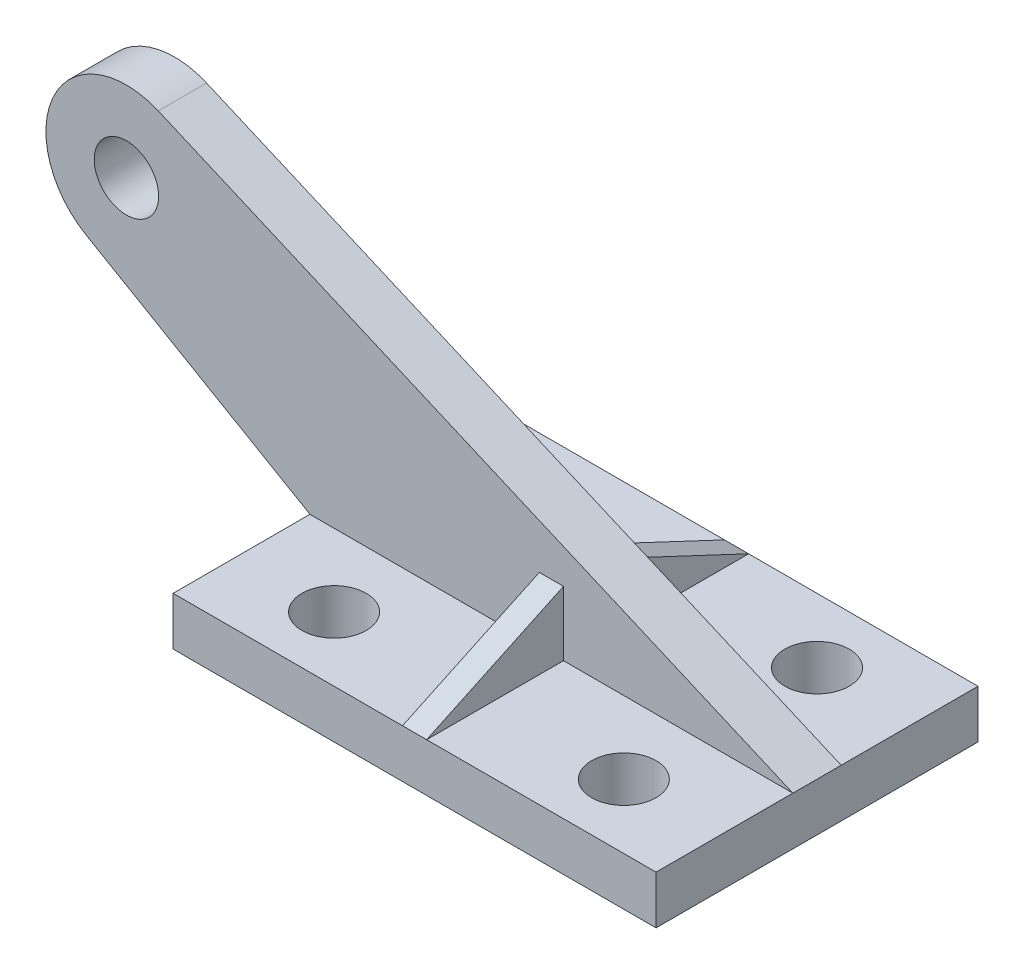
ISO-10303-21;
HEADER;
FILE_DESCRIPTION(('STEP AP214'),'2;1');
FILE_NAME('part.step','',(''),(''),'','','');
FILE_SCHEMA(('AUTOMOTIVE_DESIGN { 1 0 10303 214 1 1 1 1 }'));
ENDSEC;
DATA;
#1=APPLICATION_CONTEXT('core data for automotive mechanical design processes');
#2=APPLICATION_PROTOCOL_DEFINITION('international standard','automotive_design',2000,#1);
#3=PRODUCT_CONTEXT('',#1,'mechanical');
#4=PRODUCT('Part','Part','',(#3));
#5=PRODUCT_RELATED_PRODUCT_CATEGORY('part','',(#4));
#6=PRODUCT_DEFINITION_FORMATION('','',#4);
#7=PRODUCT_DEFINITION_CONTEXT('part definition',#1,'design');
#8=PRODUCT_DEFINITION('design','',#6,#7);
#9=PRODUCT_DEFINITION_SHAPE('','',#8);
#10=(LENGTH_UNIT() NAMED_UNIT(*) SI_UNIT(.MILLI.,.METRE.));
#11=(NAMED_UNIT(*) PLANE_ANGLE_UNIT() SI_UNIT($,.RADIAN.));
#12=(NAMED_UNIT(*) SI_UNIT($,.STERADIAN.) SOLID_ANGLE_UNIT());
#13=UNCERTAINTY_MEASURE_WITH_UNIT(LENGTH_MEASURE(1.E-05),#10,'distance_accuracy_value','');
#14=(GEOMETRIC_REPRESENTATION_CONTEXT(3) GLOBAL_UNCERTAINTY_ASSIGNED_CONTEXT((#13)) GLOBAL_UNIT_ASSIGNED_CONTEXT((#10,
#11,#12)) REPRESENTATION_CONTEXT('',''));
#15=CARTESIAN_POINT('',(0.,0.,0.));
#16=DIRECTION('',(0.,0.,1.));
#17=DIRECTION('',(1.,0.,0.));
#18=AXIS2_PLACEMENT_3D('',#15,#16,#17);
#19=CARTESIAN_POINT('',(-75.,15.,-50.));
#20=DIRECTION('',(0.,1.,0.));
#21=DIRECTION('',(0.,0.,1.));
#22=AXIS2_PLACEMENT_3D('',#19,#20,#21);
#23=PLANE('',#22);
#24=CARTESIAN_POINT('',(45.,15.,-30.));
#25=DIRECTION('',(0.,1.,0.));
#26=DIRECTION('',(0.,0.,1.));
#27=AXIS2_PLACEMENT_3D('',#24,#25,#26);
#28=CIRCLE('',#27,10.);
#29=CARTESIAN_POINT('',(45.,15.,-20.));
#30=VERTEX_POINT('',#29);
#31=EDGE_CURVE('E404',#30,#30,#28,.T.);
#32=ORIENTED_EDGE('',*,*,#31,.F.);
#33=EDGE_LOOP('',(#32));
#34=FACE_BOUND('',#33,.T.);
#35=DIRECTION('',(-1.,0.,0.));
#36=VECTOR('',#35,1.);
#37=CARTESIAN_POINT('',(-75.,15.,-50.));
#38=LINE('',#37,#36);
#39=CARTESIAN_POINT('',(75.,15.,-50.));
#40=VERTEX_POINT('',#39);
#41=CARTESIAN_POINT('',(3.75,15.,-50.));
#42=VERTEX_POINT('',#41);
#43=EDGE_CURVE('E167',#40,#42,#38,.T.);
#44=ORIENTED_EDGE('',*,*,#43,.T.);
#45=DIRECTION('',(0.,0.,1.));
#46=VECTOR('',#45,1.);
#47=CARTESIAN_POINT('',(3.75,15.,-7.5));
#48=LINE('',#47,#46);
#49=CARTESIAN_POINT('',(3.75,15.,-7.5));
#50=VERTEX_POINT('',#49);
#51=EDGE_CURVE('E166',#42,#50,#48,.T.);
#52=ORIENTED_EDGE('',*,*,#51,.T.);
#53=DIRECTION('',(1.,0.,0.));
#54=VECTOR('',#53,1.);
#55=CARTESIAN_POINT('',(75.,15.,-7.5));
#56=LINE('',#55,#54);
#57=CARTESIAN_POINT('',(75.,15.,-7.5));
#58=VERTEX_POINT('',#57);
#59=EDGE_CURVE('E150',#50,#58,#56,.T.);
#60=ORIENTED_EDGE('',*,*,#59,.T.);
#61=DIRECTION('',(0.,0.,1.));
#62=VECTOR('',#61,1.);
#63=CARTESIAN_POINT('',(75.,15.,-50.));
#64=LINE('',#63,#62);
#65=EDGE_CURVE('E305',#40,#58,#64,.T.);
#66=ORIENTED_EDGE('',*,*,#65,.F.);
#67=EDGE_LOOP('',(#44,#52,#60,#66));
#68=FACE_BOUND('',#67,.T.);
#69=ADVANCED_FACE('F45',(#34,#68),#23,.T.);
#70=CARTESIAN_POINT('',(45.,15.,30.));
#71=DIRECTION('',(0.,1.,0.));
#72=DIRECTION('',(0.,0.,1.));
#73=AXIS2_PLACEMENT_3D('',#70,#71,#72);
#74=CIRCLE('',#73,10.);
#75=CARTESIAN_POINT('',(45.,15.,40.));
#76=VERTEX_POINT('',#75);
#77=EDGE_CURVE('E401',#76,#76,#74,.T.);
#78=ORIENTED_EDGE('',*,*,#77,.F.);
#79=EDGE_LOOP('',(#78));
#80=FACE_BOUND('',#79,.T.);
#81=DIRECTION('',(1.,0.,0.));
#82=VECTOR('',#81,1.);
#83=CARTESIAN_POINT('',(75.,15.,7.5));
#84=LINE('',#83,#82);
#85=CARTESIAN_POINT('',(3.75,15.,7.5));
#86=VERTEX_POINT('',#85);
#87=CARTESIAN_POINT('',(75.,15.,7.5));
#88=VERTEX_POINT('',#87);
#89=EDGE_CURVE('E233',#86,#88,#84,.T.);
#90=ORIENTED_EDGE('',*,*,#89,.F.);
#91=DIRECTION('',(0.,0.,-1.));
#92=VECTOR('',#91,1.);
#93=CARTESIAN_POINT('',(3.75,15.,7.5));
#94=LINE('',#93,#92);
#95=CARTESIAN_POINT('',(3.75,15.,50.));
#96=VERTEX_POINT('',#95);
#97=EDGE_CURVE('E194',#96,#86,#94,.T.);
#98=ORIENTED_EDGE('',*,*,#97,.F.);
#99=DIRECTION('',(-1.,0.,0.));
#100=VECTOR('',#99,1.);
#101=CARTESIAN_POINT('',(-75.,15.,50.));
#102=LINE('',#101,#100);
#103=CARTESIAN_POINT('',(75.,15.,50.));
#104=VERTEX_POINT('',#103);
#105=EDGE_CURVE('E286',#104,#96,#102,.T.);
#106=ORIENTED_EDGE('',*,*,#105,.F.);
#107=EDGE_CURVE('E308',#88,#104,#64,.T.);
#108=ORIENTED_EDGE('',*,*,#107,.F.);
#109=EDGE_LOOP('',(#90,#98,#106,#108));
#110=FACE_BOUND('',#109,.T.);
#111=ADVANCED_FACE('F352',(#80,#110),#23,.T.);
#112=CARTESIAN_POINT('',(-45.,15.,-30.0000000000006));
#113=DIRECTION('',(0.,1.,0.));
#114=DIRECTION('',(0.,0.,1.));
#115=AXIS2_PLACEMENT_3D('',#112,#113,#114);
#116=CIRCLE('',#115,10.);
#117=CARTESIAN_POINT('',(-45.,15.,-20.0000000000006));
#118=VERTEX_POINT('',#117);
#119=EDGE_CURVE('E392',#118,#118,#116,.T.);
#120=ORIENTED_EDGE('',*,*,#119,.F.);
#121=EDGE_LOOP('',(#120));
#122=FACE_BOUND('',#121,.T.);
#123=DIRECTION('',(0.,0.,1.));
#124=VECTOR('',#123,1.);
#125=CARTESIAN_POINT('',(-3.75,15.,-7.5));
#126=LINE('',#125,#124);
#127=CARTESIAN_POINT('',(-3.75,15.,-50.));
#128=VERTEX_POINT('',#127);
#129=CARTESIAN_POINT('',(-3.75,15.,-7.5));
#130=VERTEX_POINT('',#129);
#131=EDGE_CURVE('E63',#128,#130,#126,.T.);
#132=ORIENTED_EDGE('',*,*,#131,.F.);
#133=CARTESIAN_POINT('',(-75.,15.,-50.));
#134=VERTEX_POINT('',#133);
#135=EDGE_CURVE('E302',#128,#134,#38,.T.);
#136=ORIENTED_EDGE('',*,*,#135,.T.);
#137=DIRECTION('',(0.,0.,1.));
#138=VECTOR('',#137,1.);
#139=CARTESIAN_POINT('',(-75.,15.,-50.));
#140=LINE('',#139,#138);
#141=CARTESIAN_POINT('',(-75.,15.,-7.5));
#142=VERTEX_POINT('',#141);
#143=EDGE_CURVE('E11',#134,#142,#140,.T.);
#144=ORIENTED_EDGE('',*,*,#143,.T.);
#145=EDGE_CURVE('E162',#142,#130,#56,.T.);
#146=ORIENTED_EDGE('',*,*,#145,.T.);
#147=EDGE_LOOP('',(#132,#136,#144,#146));
#148=FACE_BOUND('',#147,.T.);
#149=ADVANCED_FACE('F336',(#122,#148),#23,.T.);
#150=CARTESIAN_POINT('',(-75.,15.,-50.));
#151=DIRECTION('',(-1.,0.,0.));
#152=DIRECTION('',(0.,0.,1.));
#153=AXIS2_PLACEMENT_3D('',#150,#151,#152);
#154=PLANE('',#153);
#155=DIRECTION('',(0.,0.,1.));
#156=VECTOR('',#155,1.);
#157=CARTESIAN_POINT('',(-75.,0.,-50.));
#158=LINE('',#157,#156);
#159=CARTESIAN_POINT('',(-75.,0.,-50.));
#160=VERTEX_POINT('',#159);
#161=CARTESIAN_POINT('',(-75.,0.,50.));
#162=VERTEX_POINT('',#161);
#163=EDGE_CURVE('E49',#160,#162,#158,.T.);
#164=ORIENTED_EDGE('',*,*,#163,.T.);
#165=DIRECTION('',(0.,-1.,0.));
#166=VECTOR('',#165,1.);
#167=CARTESIAN_POINT('',(-75.,15.,50.));
#168=LINE('',#167,#166);
#169=CARTESIAN_POINT('',(-75.,15.,50.));
#170=VERTEX_POINT('',#169);
#171=EDGE_CURVE('E264',#170,#162,#168,.T.);
#172=ORIENTED_EDGE('',*,*,#171,.F.);
#173=CARTESIAN_POINT('',(-75.,15.,7.5));
#174=VERTEX_POINT('',#173);
#175=EDGE_CURVE('E55',#174,#170,#140,.T.);
#176=ORIENTED_EDGE('',*,*,#175,.F.);
#177=DIRECTION('',(0.,0.,1.));
#178=VECTOR('',#177,1.);
#179=CARTESIAN_POINT('',(-75.,15.,-7.5));
#180=LINE('',#179,#178);
#181=EDGE_CURVE('E261',#142,#174,#180,.T.);
#182=ORIENTED_EDGE('',*,*,#181,.F.);
#183=ORIENTED_EDGE('',*,*,#143,.F.);
#184=DIRECTION('',(0.,-1.,0.));
#185=VECTOR('',#184,1.);
#186=CARTESIAN_POINT('',(-75.,15.,-50.));
#187=LINE('',#186,#185);
#188=EDGE_CURVE('E290',#134,#160,#187,.T.);
#189=ORIENTED_EDGE('',*,*,#188,.T.);
#190=EDGE_LOOP('',(#164,#172,#176,#182,#183,#189));
#191=FACE_BOUND('',#190,.T.);
#192=ADVANCED_FACE('F47',(#191),#154,.T.);
#193=CARTESIAN_POINT('',(-45.,15.,30.0000000000006));
#194=DIRECTION('',(0.,1.,0.));
#195=DIRECTION('',(0.,0.,1.));
#196=AXIS2_PLACEMENT_3D('',#193,#194,#195);
#197=CIRCLE('',#196,10.);
#198=CARTESIAN_POINT('',(-45.,15.,40.0000000000006));
#199=VERTEX_POINT('',#198);
#200=EDGE_CURVE('E415',#199,#199,#197,.T.);
#201=ORIENTED_EDGE('',*,*,#200,.F.);
#202=EDGE_LOOP('',(#201));
#203=FACE_BOUND('',#202,.T.);
#204=DIRECTION('',(0.,0.,-1.));
#205=VECTOR('',#204,1.);
#206=CARTESIAN_POINT('',(-3.75,15.,7.5));
#207=LINE('',#206,#205);
#208=CARTESIAN_POINT('',(-3.75,15.,50.));
#209=VERTEX_POINT('',#208);
#210=CARTESIAN_POINT('',(-3.75,15.,7.5));
#211=VERTEX_POINT('',#210);
#212=EDGE_CURVE('E206',#209,#211,#207,.T.);
#213=ORIENTED_EDGE('',*,*,#212,.T.);
#214=EDGE_CURVE('E234',#174,#211,#84,.T.);
#215=ORIENTED_EDGE('',*,*,#214,.F.);
#216=ORIENTED_EDGE('',*,*,#175,.T.);
#217=EDGE_CURVE('E285',#209,#170,#102,.T.);
#218=ORIENTED_EDGE('',*,*,#217,.F.);
#219=EDGE_LOOP('',(#213,#215,#216,#218));
#220=FACE_BOUND('',#219,.T.);
#221=ADVANCED_FACE('F331',(#203,#220),#23,.T.);
#222=CARTESIAN_POINT('',(75.,15.,-50.));
#223=DIRECTION('',(1.,0.,0.));
#224=DIRECTION('',(0.,0.,-1.));
#225=AXIS2_PLACEMENT_3D('',#222,#223,#224);
#226=PLANE('',#225);
#227=ORIENTED_EDGE('',*,*,#65,.T.);
#228=DIRECTION('',(0.,0.,1.));
#229=VECTOR('',#228,1.);
#230=CARTESIAN_POINT('',(75.,15.,-7.5));
#231=LINE('',#230,#229);
#232=EDGE_CURVE('E260',#58,#88,#231,.T.);
#233=ORIENTED_EDGE('',*,*,#232,.T.);
#234=ORIENTED_EDGE('',*,*,#107,.T.);
#235=DIRECTION('',(0.,1.,0.));
#236=VECTOR('',#235,1.);
#237=CARTESIAN_POINT('',(75.,15.,50.));
#238=LINE('',#237,#236);
#239=CARTESIAN_POINT('',(75.,0.,50.));
#240=VERTEX_POINT('',#239);
#241=EDGE_CURVE('E281',#240,#104,#238,.T.);
#242=ORIENTED_EDGE('',*,*,#241,.F.);
#243=DIRECTION('',(0.,0.,1.));
#244=VECTOR('',#243,1.);
#245=CARTESIAN_POINT('',(75.,0.,-50.));
#246=LINE('',#245,#244);
#247=CARTESIAN_POINT('',(75.,0.,-50.));
#248=VERTEX_POINT('',#247);
#249=EDGE_CURVE('E309',#248,#240,#246,.T.);
#250=ORIENTED_EDGE('',*,*,#249,.F.);
#251=DIRECTION('',(0.,1.,0.));
#252=VECTOR('',#251,1.);
#253=CARTESIAN_POINT('',(75.,15.,-50.));
#254=LINE('',#253,#252);
#255=EDGE_CURVE('E298',#248,#40,#254,.T.);
#256=ORIENTED_EDGE('',*,*,#255,.T.);
#257=EDGE_LOOP('',(#227,#233,#234,#242,#250,#256));
#258=FACE_BOUND('',#257,.T.);
#259=ADVANCED_FACE('F354',(#258),#226,.T.);
#260=CARTESIAN_POINT('',(-75.,0.,-50.));
#261=DIRECTION('',(0.,-1.,0.));
#262=DIRECTION('',(0.,0.,-1.));
#263=AXIS2_PLACEMENT_3D('',#260,#261,#262);
#264=PLANE('',#263);
#265=CARTESIAN_POINT('',(45.,0.,-30.));
#266=DIRECTION('',(0.,-1.,0.));
#267=DIRECTION('',(0.,0.,-1.));
#268=AXIS2_PLACEMENT_3D('',#265,#266,#267);
#269=CIRCLE('',#268,10.);
#270=CARTESIAN_POINT('',(45.,0.,-40.));
#271=VERTEX_POINT('',#270);
#272=EDGE_CURVE('E396',#271,#271,#269,.T.);
#273=ORIENTED_EDGE('',*,*,#272,.F.);
#274=EDGE_LOOP('',(#273));
#275=FACE_BOUND('',#274,.T.);
#276=CARTESIAN_POINT('',(-45.,0.,-30.0000000000006));
#277=DIRECTION('',(0.,-1.,0.));
#278=DIRECTION('',(0.,0.,-1.));
#279=AXIS2_PLACEMENT_3D('',#276,#277,#278);
#280=CIRCLE('',#279,10.);
#281=CARTESIAN_POINT('',(-45.,0.,-40.0000000000006));
#282=VERTEX_POINT('',#281);
#283=EDGE_CURVE('E395',#282,#282,#280,.T.);
#284=ORIENTED_EDGE('',*,*,#283,.F.);
#285=EDGE_LOOP('',(#284));
#286=FACE_BOUND('',#285,.T.);
#287=CARTESIAN_POINT('',(45.,0.,30.));
#288=DIRECTION('',(0.,-1.,0.));
#289=DIRECTION('',(0.,0.,-1.));
#290=AXIS2_PLACEMENT_3D('',#287,#288,#289);
#291=CIRCLE('',#290,10.);
#292=CARTESIAN_POINT('',(45.,0.,20.));
#293=VERTEX_POINT('',#292);
#294=EDGE_CURVE('E411',#293,#293,#291,.T.);
#295=ORIENTED_EDGE('',*,*,#294,.F.);
#296=EDGE_LOOP('',(#295));
#297=FACE_BOUND('',#296,.T.);
#298=CARTESIAN_POINT('',(-45.,0.,30.0000000000006));
#299=DIRECTION('',(0.,-1.,0.));
#300=DIRECTION('',(0.,0.,-1.));
#301=AXIS2_PLACEMENT_3D('',#298,#299,#300);
#302=CIRCLE('',#301,10.);
#303=CARTESIAN_POINT('',(-45.,0.,20.0000000000006));
#304=VERTEX_POINT('',#303);
#305=EDGE_CURVE('E173',#304,#304,#302,.T.);
#306=ORIENTED_EDGE('',*,*,#305,.F.);
#307=EDGE_LOOP('',(#306));
#308=FACE_BOUND('',#307,.T.);
#309=ORIENTED_EDGE('',*,*,#249,.T.);
#310=DIRECTION('',(1.,0.,0.));
#311=VECTOR('',#310,1.);
#312=CARTESIAN_POINT('',(-75.,0.,50.));
#313=LINE('',#312,#311);
#314=EDGE_CURVE('E277',#162,#240,#313,.T.);
#315=ORIENTED_EDGE('',*,*,#314,.F.);
#316=ORIENTED_EDGE('',*,*,#163,.F.);
#317=DIRECTION('',(1.,0.,0.));
#318=VECTOR('',#317,1.);
#319=CARTESIAN_POINT('',(-75.,0.,-50.));
#320=LINE('',#319,#318);
#321=EDGE_CURVE('E294',#160,#248,#320,.T.);
#322=ORIENTED_EDGE('',*,*,#321,.T.);
#323=EDGE_LOOP('',(#309,#315,#316,#322));
#324=FACE_BOUND('',#323,.T.);
#325=ADVANCED_FACE('F321',(#275,#286,#297,#308,#324),#264,.T.);
#326=CARTESIAN_POINT('',(0.,0.,-50.));
#327=DIRECTION('',(0.,0.,1.));
#328=DIRECTION('',(1.,0.,0.));
#329=AXIS2_PLACEMENT_3D('',#326,#327,#328);
#330=PLANE('',#329);
#331=ORIENTED_EDGE('',*,*,#188,.F.);
#332=ORIENTED_EDGE('',*,*,#135,.F.);
#333=DIRECTION('',(1.,0.,0.));
#334=VECTOR('',#333,1.);
#335=CARTESIAN_POINT('',(-3.75,15.,-50.));
#336=LINE('',#335,#334);
#337=EDGE_CURVE('E70',#128,#42,#336,.T.);
#338=ORIENTED_EDGE('',*,*,#337,.T.);
#339=ORIENTED_EDGE('',*,*,#43,.F.);
#340=ORIENTED_EDGE('',*,*,#255,.F.);
#341=ORIENTED_EDGE('',*,*,#321,.F.);
#342=EDGE_LOOP('',(#331,#332,#338,#339,#340,#341));
#343=FACE_BOUND('',#342,.T.);
#344=ADVANCED_FACE('F356',(#343),#330,.F.);
#345=CARTESIAN_POINT('',(0.,0.,50.));
#346=DIRECTION('',(0.,0.,1.));
#347=DIRECTION('',(1.,0.,0.));
#348=AXIS2_PLACEMENT_3D('',#345,#346,#347);
#349=PLANE('',#348);
#350=ORIENTED_EDGE('',*,*,#171,.T.);
#351=ORIENTED_EDGE('',*,*,#314,.T.);
#352=ORIENTED_EDGE('',*,*,#241,.T.);
#353=ORIENTED_EDGE('',*,*,#105,.T.);
#354=DIRECTION('',(1.,0.,0.));
#355=VECTOR('',#354,1.);
#356=CARTESIAN_POINT('',(-3.75,15.,50.));
#357=LINE('',#356,#355);
#358=EDGE_CURVE('E219',#209,#96,#357,.T.);
#359=ORIENTED_EDGE('',*,*,#358,.F.);
#360=ORIENTED_EDGE('',*,*,#217,.T.);
#361=EDGE_LOOP('',(#350,#351,#352,#353,#359,#360));
#362=FACE_BOUND('',#361,.T.);
#363=ADVANCED_FACE('F324',(#362),#349,.T.);
#364=CARTESIAN_POINT('',(-75.,15.,-7.5));
#365=DIRECTION('',(-0.502083797715354,-0.864818975318955,0.));
#366=DIRECTION('',(0.864818975318955,-0.502083797715354,0.));
#367=AXIS2_PLACEMENT_3D('',#364,#365,#366);
#368=PLANE('',#367);
#369=ORIENTED_EDGE('',*,*,#181,.T.);
#370=DIRECTION('',(0.864818975318955,-0.502083797715354,0.));
#371=VECTOR('',#370,1.);
#372=CARTESIAN_POINT('',(-75.,15.,7.5));
#373=LINE('',#372,#371);
#374=CARTESIAN_POINT('',(-144.552094942884,55.3795256170261,7.5));
#375=VERTEX_POINT('',#374);
#376=EDGE_CURVE('E163',#375,#174,#373,.T.);
#377=ORIENTED_EDGE('',*,*,#376,.F.);
#378=DIRECTION('',(0.,0.,1.));
#379=VECTOR('',#378,1.);
#380=CARTESIAN_POINT('',(-144.552094942884,55.3795256170261,-7.5));
#381=LINE('',#380,#379);
#382=CARTESIAN_POINT('',(-144.552094942884,55.3795256170261,-7.5));
#383=VERTEX_POINT('',#382);
#384=EDGE_CURVE('E265',#383,#375,#381,.T.);
#385=ORIENTED_EDGE('',*,*,#384,.F.);
#386=DIRECTION('',(0.864818975318955,-0.502083797715354,0.));
#387=VECTOR('',#386,1.);
#388=CARTESIAN_POINT('',(-75.,15.,-7.5));
#389=LINE('',#388,#387);
#390=EDGE_CURVE('E256',#383,#142,#389,.T.);
#391=ORIENTED_EDGE('',*,*,#390,.T.);
#392=EDGE_LOOP('',(#369,#377,#385,#391));
#393=FACE_BOUND('',#392,.T.);
#394=ADVANCED_FACE('F364',(#393),#368,.T.);
#395=CARTESIAN_POINT('',(-132.,77.,-7.5));
#396=DIRECTION('',(0.,0.,1.));
#397=DIRECTION('',(1.,0.,0.));
#398=AXIS2_PLACEMENT_3D('',#395,#396,#397);
#399=CYLINDRICAL_SURFACE('',#398,25.);
#400=ORIENTED_EDGE('',*,*,#384,.T.);
#401=CARTESIAN_POINT('',(-132.,77.,7.5));
#402=DIRECTION('',(0.,0.,1.));
#403=DIRECTION('',(1.,0.,0.));
#404=AXIS2_PLACEMENT_3D('',#401,#402,#403);
#405=CIRCLE('',#404,25.);
#406=CARTESIAN_POINT('',(-122.104328520036,99.9581289734294,7.5));
#407=VERTEX_POINT('',#406);
#408=EDGE_CURVE('E242',#407,#375,#405,.T.);
#409=ORIENTED_EDGE('',*,*,#408,.F.);
#410=DIRECTION('',(0.,0.,1.));
#411=VECTOR('',#410,1.);
#412=CARTESIAN_POINT('',(-122.104328520036,99.9581289734294,-7.5));
#413=LINE('',#412,#411);
#414=CARTESIAN_POINT('',(-122.104328520036,99.9581289734294,-7.5));
#415=VERTEX_POINT('',#414);
#416=EDGE_CURVE('E268',#415,#407,#413,.T.);
#417=ORIENTED_EDGE('',*,*,#416,.F.);
#418=CARTESIAN_POINT('',(-132.,77.,-7.5));
#419=DIRECTION('',(0.,0.,1.));
#420=DIRECTION('',(1.,0.,0.));
#421=AXIS2_PLACEMENT_3D('',#418,#419,#420);
#422=CIRCLE('',#421,25.);
#423=EDGE_CURVE('E252',#415,#383,#422,.T.);
#424=ORIENTED_EDGE('',*,*,#423,.T.);
#425=EDGE_LOOP('',(#400,#409,#417,#424));
#426=FACE_BOUND('',#425,.T.);
#427=ADVANCED_FACE('F466',(#426),#399,.T.);
#428=CARTESIAN_POINT('',(75.,15.,-7.5));
#429=DIRECTION('',(0.395826859198575,0.918325158937177,0.));
#430=DIRECTION('',(-0.918325158937177,0.395826859198575,0.));
#431=AXIS2_PLACEMENT_3D('',#428,#429,#430);
#432=PLANE('',#431);
#433=ORIENTED_EDGE('',*,*,#416,.T.);
#434=DIRECTION('',(-0.918325158937177,0.395826859198575,0.));
#435=VECTOR('',#434,1.);
#436=CARTESIAN_POINT('',(75.,15.,7.5));
#437=LINE('',#436,#435);
#438=EDGE_CURVE('E238',#88,#407,#437,.T.);
#439=ORIENTED_EDGE('',*,*,#438,.F.);
#440=ORIENTED_EDGE('',*,*,#232,.F.);
#441=DIRECTION('',(-0.918325158937177,0.395826859198575,0.));
#442=VECTOR('',#441,1.);
#443=CARTESIAN_POINT('',(75.,15.,-7.5));
#444=LINE('',#443,#442);
#445=EDGE_CURVE('E158',#58,#415,#444,.T.);
#446=ORIENTED_EDGE('',*,*,#445,.T.);
#447=EDGE_LOOP('',(#433,#439,#440,#446));
#448=FACE_BOUND('',#447,.T.);
#449=ADVANCED_FACE('F350',(#448),#432,.T.);
#450=CARTESIAN_POINT('',(-132.,77.,-7.5));
#451=DIRECTION('',(0.,0.,1.));
#452=DIRECTION('',(1.,0.,0.));
#453=AXIS2_PLACEMENT_3D('',#450,#451,#452);
#454=PLANE('',#453);
#455=CARTESIAN_POINT('',(-132.,77.,-7.5));
#456=DIRECTION('',(0.,0.,1.));
#457=DIRECTION('',(1.,0.,0.));
#458=AXIS2_PLACEMENT_3D('',#455,#456,#457);
#459=CIRCLE('',#458,10.);
#460=CARTESIAN_POINT('',(-122.,77.,-7.5));
#461=VERTEX_POINT('',#460);
#462=EDGE_CURVE('E229',#461,#461,#459,.T.);
#463=ORIENTED_EDGE('',*,*,#462,.T.);
#464=EDGE_LOOP('',(#463));
#465=FACE_BOUND('',#464,.T.);
#466=DIRECTION('',(1.,0.,0.));
#467=VECTOR('',#466,1.);
#468=CARTESIAN_POINT('',(-3.75,35.,-7.5));
#469=LINE('',#468,#467);
#470=CARTESIAN_POINT('',(-3.75,35.,-7.5));
#471=VERTEX_POINT('',#470);
#472=CARTESIAN_POINT('',(3.75,35.,-7.5));
#473=VERTEX_POINT('',#472);
#474=EDGE_CURVE('E191',#471,#473,#469,.T.);
#475=ORIENTED_EDGE('',*,*,#474,.F.);
#476=DIRECTION('',(0.,1.,0.));
#477=VECTOR('',#476,1.);
#478=CARTESIAN_POINT('',(-3.75,15.,-7.5));
#479=LINE('',#478,#477);
#480=EDGE_CURVE('E187',#130,#471,#479,.T.);
#481=ORIENTED_EDGE('',*,*,#480,.F.);
#482=ORIENTED_EDGE('',*,*,#145,.F.);
#483=ORIENTED_EDGE('',*,*,#390,.F.);
#484=ORIENTED_EDGE('',*,*,#423,.F.);
#485=ORIENTED_EDGE('',*,*,#445,.F.);
#486=ORIENTED_EDGE('',*,*,#59,.F.);
#487=DIRECTION('',(0.,1.,0.));
#488=VECTOR('',#487,1.);
#489=CARTESIAN_POINT('',(3.75,15.,-7.5));
#490=LINE('',#489,#488);
#491=EDGE_CURVE('E154',#50,#473,#490,.T.);
#492=ORIENTED_EDGE('',*,*,#491,.T.);
#493=EDGE_LOOP('',(#475,#481,#482,#483,#484,#485,#486,#492));
#494=FACE_BOUND('',#493,.T.);
#495=ADVANCED_FACE('F152',(#465,#494),#454,.F.);
#496=CARTESIAN_POINT('',(-132.,77.,7.5));
#497=DIRECTION('',(0.,0.,1.));
#498=DIRECTION('',(1.,0.,0.));
#499=AXIS2_PLACEMENT_3D('',#496,#497,#498);
#500=PLANE('',#499);
#501=DIRECTION('',(0.,1.,0.));
#502=VECTOR('',#501,1.);
#503=CARTESIAN_POINT('',(-3.75,15.,7.5));
#504=LINE('',#503,#502);
#505=CARTESIAN_POINT('',(-3.75,35.,7.5));
#506=VERTEX_POINT('',#505);
#507=EDGE_CURVE('E210',#211,#506,#504,.T.);
#508=ORIENTED_EDGE('',*,*,#507,.T.);
#509=DIRECTION('',(1.,0.,0.));
#510=VECTOR('',#509,1.);
#511=CARTESIAN_POINT('',(-3.75,35.,7.5));
#512=LINE('',#511,#510);
#513=CARTESIAN_POINT('',(3.75,35.,7.5));
#514=VERTEX_POINT('',#513);
#515=EDGE_CURVE('E218',#506,#514,#512,.T.);
#516=ORIENTED_EDGE('',*,*,#515,.T.);
#517=DIRECTION('',(0.,1.,0.));
#518=VECTOR('',#517,1.);
#519=CARTESIAN_POINT('',(3.75,15.,7.5));
#520=LINE('',#519,#518);
#521=EDGE_CURVE('E199',#86,#514,#520,.T.);
#522=ORIENTED_EDGE('',*,*,#521,.F.);
#523=ORIENTED_EDGE('',*,*,#89,.T.);
#524=ORIENTED_EDGE('',*,*,#438,.T.);
#525=ORIENTED_EDGE('',*,*,#408,.T.);
#526=ORIENTED_EDGE('',*,*,#376,.T.);
#527=ORIENTED_EDGE('',*,*,#214,.T.);
#528=EDGE_LOOP('',(#508,#516,#522,#523,#524,#525,#526,#527));
#529=FACE_BOUND('',#528,.T.);
#530=CARTESIAN_POINT('',(-132.,77.,7.5));
#531=DIRECTION('',(0.,0.,1.));
#532=DIRECTION('',(1.,0.,0.));
#533=AXIS2_PLACEMENT_3D('',#530,#531,#532);
#534=CIRCLE('',#533,10.);
#535=CARTESIAN_POINT('',(-122.,77.,7.5));
#536=VERTEX_POINT('',#535);
#537=EDGE_CURVE('E222',#536,#536,#534,.T.);
#538=ORIENTED_EDGE('',*,*,#537,.F.);
#539=EDGE_LOOP('',(#538));
#540=FACE_BOUND('',#539,.T.);
#541=ADVANCED_FACE('F343',(#529,#540),#500,.T.);
#542=CARTESIAN_POINT('',(-132.,77.,7.5));
#543=DIRECTION('',(0.,0.,1.));
#544=DIRECTION('',(1.,0.,0.));
#545=AXIS2_PLACEMENT_3D('',#542,#543,#544);
#546=CYLINDRICAL_SURFACE('',#545,10.);
#547=ORIENTED_EDGE('',*,*,#462,.F.);
#548=EDGE_LOOP('',(#547));
#549=FACE_BOUND('',#548,.T.);
#550=ORIENTED_EDGE('',*,*,#537,.T.);
#551=EDGE_LOOP('',(#550));
#552=FACE_BOUND('',#551,.T.);
#553=ADVANCED_FACE('F455',(#549,#552),#546,.F.);
#554=CARTESIAN_POINT('',(-3.75,15.,50.));
#555=DIRECTION('',(0.,0.904818702200994,0.42579703632988));
#556=DIRECTION('',(0.,-0.42579703632988,0.904818702200994));
#557=AXIS2_PLACEMENT_3D('',#554,#555,#556);
#558=PLANE('',#557);
#559=ORIENTED_EDGE('',*,*,#358,.T.);
#560=DIRECTION('',(0.,-0.42579703632988,0.904818702200994));
#561=VECTOR('',#560,1.);
#562=CARTESIAN_POINT('',(3.75,15.,50.));
#563=LINE('',#562,#561);
#564=EDGE_CURVE('E202',#514,#96,#563,.T.);
#565=ORIENTED_EDGE('',*,*,#564,.F.);
#566=ORIENTED_EDGE('',*,*,#515,.F.);
#567=DIRECTION('',(0.,-0.42579703632988,0.904818702200994));
#568=VECTOR('',#567,1.);
#569=CARTESIAN_POINT('',(-3.75,15.,50.));
#570=LINE('',#569,#568);
#571=EDGE_CURVE('E214',#506,#209,#570,.T.);
#572=ORIENTED_EDGE('',*,*,#571,.T.);
#573=EDGE_LOOP('',(#559,#565,#566,#572));
#574=FACE_BOUND('',#573,.T.);
#575=ADVANCED_FACE('F451',(#574),#558,.T.);
#576=CARTESIAN_POINT('',(-3.75,0.,0.));
#577=DIRECTION('',(-1.,0.,0.));
#578=DIRECTION('',(0.,0.,1.));
#579=AXIS2_PLACEMENT_3D('',#576,#577,#578);
#580=PLANE('',#579);
#581=ORIENTED_EDGE('',*,*,#212,.F.);
#582=ORIENTED_EDGE('',*,*,#571,.F.);
#583=ORIENTED_EDGE('',*,*,#507,.F.);
#584=EDGE_LOOP('',(#581,#582,#583));
#585=FACE_BOUND('',#584,.T.);
#586=ADVANCED_FACE('F447',(#585),#580,.T.);
#587=CARTESIAN_POINT('',(3.75,0.,0.));
#588=DIRECTION('',(-1.,0.,0.));
#589=DIRECTION('',(0.,0.,1.));
#590=AXIS2_PLACEMENT_3D('',#587,#588,#589);
#591=PLANE('',#590);
#592=ORIENTED_EDGE('',*,*,#97,.T.);
#593=ORIENTED_EDGE('',*,*,#521,.T.);
#594=ORIENTED_EDGE('',*,*,#564,.T.);
#595=EDGE_LOOP('',(#592,#593,#594));
#596=FACE_BOUND('',#595,.T.);
#597=ADVANCED_FACE('F444',(#596),#591,.F.);
#598=CARTESIAN_POINT('',(-3.75,15.,-50.));
#599=DIRECTION('',(0.,-0.904818702200994,0.42579703632988));
#600=DIRECTION('',(0.,-0.42579703632988,-0.904818702200994));
#601=AXIS2_PLACEMENT_3D('',#598,#599,#600);
#602=PLANE('',#601);
#603=ORIENTED_EDGE('',*,*,#474,.T.);
#604=DIRECTION('',(0.,-0.42579703632988,-0.904818702200994));
#605=VECTOR('',#604,1.);
#606=CARTESIAN_POINT('',(3.75,15.,-50.));
#607=LINE('',#606,#605);
#608=EDGE_CURVE('E172',#473,#42,#607,.T.);
#609=ORIENTED_EDGE('',*,*,#608,.T.);
#610=ORIENTED_EDGE('',*,*,#337,.F.);
#611=DIRECTION('',(0.,-0.42579703632988,-0.904818702200994));
#612=VECTOR('',#611,1.);
#613=CARTESIAN_POINT('',(-3.75,15.,-50.));
#614=LINE('',#613,#612);
#615=EDGE_CURVE('E180',#471,#128,#614,.T.);
#616=ORIENTED_EDGE('',*,*,#615,.F.);
#617=EDGE_LOOP('',(#603,#609,#610,#616));
#618=FACE_BOUND('',#617,.T.);
#619=ADVANCED_FACE('F440',(#618),#602,.F.);
#620=CARTESIAN_POINT('',(-3.75,0.,0.));
#621=DIRECTION('',(-1.,0.,0.));
#622=DIRECTION('',(0.,0.,-1.));
#623=AXIS2_PLACEMENT_3D('',#620,#621,#622);
#624=PLANE('',#623);
#625=ORIENTED_EDGE('',*,*,#131,.T.);
#626=ORIENTED_EDGE('',*,*,#480,.T.);
#627=ORIENTED_EDGE('',*,*,#615,.T.);
#628=EDGE_LOOP('',(#625,#626,#627));
#629=FACE_BOUND('',#628,.T.);
#630=ADVANCED_FACE('F434',(#629),#624,.T.);
#631=CARTESIAN_POINT('',(3.75,0.,0.));
#632=DIRECTION('',(-1.,0.,0.));
#633=DIRECTION('',(0.,0.,-1.));
#634=AXIS2_PLACEMENT_3D('',#631,#632,#633);
#635=PLANE('',#634);
#636=ORIENTED_EDGE('',*,*,#51,.F.);
#637=ORIENTED_EDGE('',*,*,#608,.F.);
#638=ORIENTED_EDGE('',*,*,#491,.F.);
#639=EDGE_LOOP('',(#636,#637,#638));
#640=FACE_BOUND('',#639,.T.);
#641=ADVANCED_FACE('F175',(#640),#635,.F.);
#642=CARTESIAN_POINT('',(-45.,15.,30.0000000000006));
#643=DIRECTION('',(0.,1.,0.));
#644=DIRECTION('',(0.,0.,1.));
#645=AXIS2_PLACEMENT_3D('',#642,#643,#644);
#646=CYLINDRICAL_SURFACE('',#645,10.);
#647=ORIENTED_EDGE('',*,*,#200,.T.);
#648=EDGE_LOOP('',(#647));
#649=FACE_BOUND('',#648,.T.);
#650=ORIENTED_EDGE('',*,*,#305,.T.);
#651=EDGE_LOOP('',(#650));
#652=FACE_BOUND('',#651,.T.);
#653=ADVANCED_FACE('F423',(#649,#652),#646,.F.);
#654=CARTESIAN_POINT('',(45.,15.,30.));
#655=DIRECTION('',(0.,1.,0.));
#656=DIRECTION('',(0.,0.,1.));
#657=AXIS2_PLACEMENT_3D('',#654,#655,#656);
#658=CYLINDRICAL_SURFACE('',#657,10.);
#659=ORIENTED_EDGE('',*,*,#77,.T.);
#660=EDGE_LOOP('',(#659));
#661=FACE_BOUND('',#660,.T.);
#662=ORIENTED_EDGE('',*,*,#294,.T.);
#663=EDGE_LOOP('',(#662));
#664=FACE_BOUND('',#663,.T.);
#665=ADVANCED_FACE('F425',(#661,#664),#658,.F.);
#666=CARTESIAN_POINT('',(-45.,15.,-30.0000000000006));
#667=DIRECTION('',(0.,1.,0.));
#668=DIRECTION('',(0.,0.,1.));
#669=AXIS2_PLACEMENT_3D('',#666,#667,#668);
#670=CYLINDRICAL_SURFACE('',#669,10.);
#671=ORIENTED_EDGE('',*,*,#119,.T.);
#672=EDGE_LOOP('',(#671));
#673=FACE_BOUND('',#672,.T.);
#674=ORIENTED_EDGE('',*,*,#283,.T.);
#675=EDGE_LOOP('',(#674));
#676=FACE_BOUND('',#675,.T.);
#677=ADVANCED_FACE('F430',(#673,#676),#670,.F.);
#678=CARTESIAN_POINT('',(45.,15.,-30.));
#679=DIRECTION('',(0.,1.,0.));
#680=DIRECTION('',(0.,0.,1.));
#681=AXIS2_PLACEMENT_3D('',#678,#679,#680);
#682=CYLINDRICAL_SURFACE('',#681,10.);
#683=ORIENTED_EDGE('',*,*,#31,.T.);
#684=EDGE_LOOP('',(#683));
#685=FACE_BOUND('',#684,.T.);
#686=ORIENTED_EDGE('',*,*,#272,.T.);
#687=EDGE_LOOP('',(#686));
#688=FACE_BOUND('',#687,.T.);
#689=ADVANCED_FACE('F550',(#685,#688),#682,.F.);
#690=CLOSED_SHELL('',(#69,#111,#149,#192,#221,#259,#325,#344,#363,#394,#427,#449,#495,#541,#553,
#575,#586,#597,#619,#630,#641,#653,#665,#677,#689));
#691=MANIFOLD_SOLID_BREP('B2',#690);
#692=ADVANCED_BREP_SHAPE_REPRESENTATION('',(#18,#691),#14);
#693=SHAPE_DEFINITION_REPRESENTATION(#9,#692);
ENDSEC;
END-ISO-10303-21;
